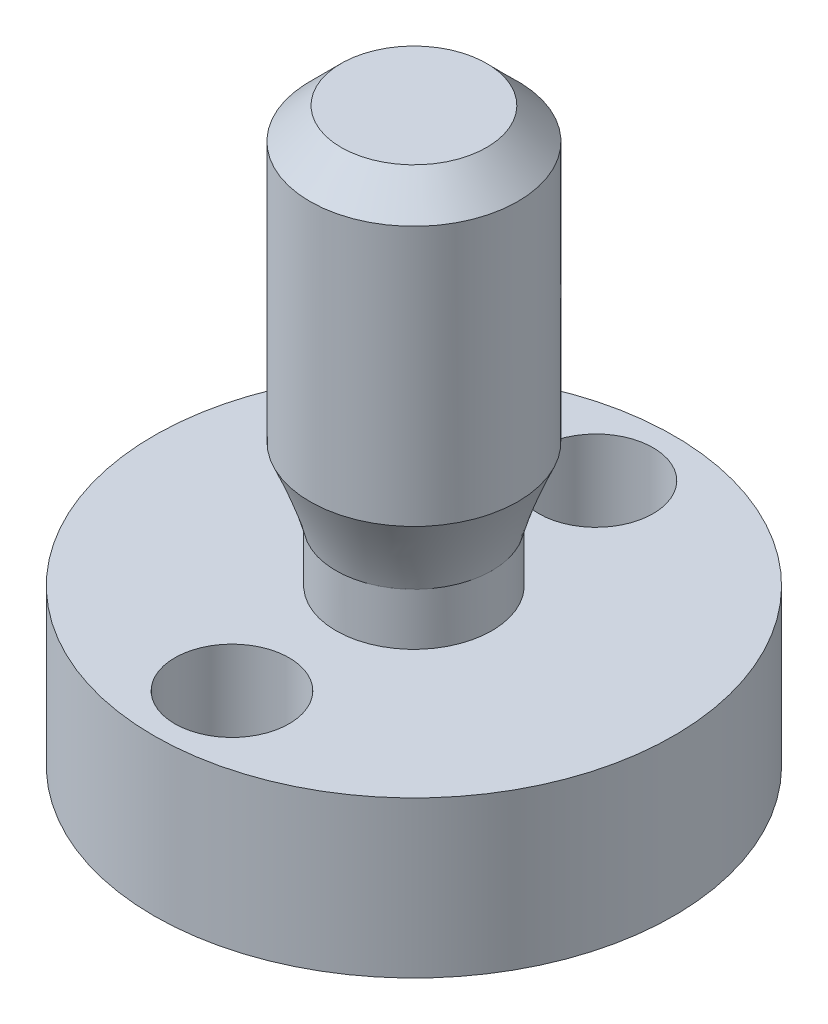
ISO-10303-21;
HEADER;
FILE_DESCRIPTION(('STEP AP214'),'2;1');
FILE_NAME('part.step','',(''),(''),'','','');
FILE_SCHEMA(('AUTOMOTIVE_DESIGN { 1 0 10303 214 1 1 1 1 }'));
ENDSEC;
DATA;
#1=APPLICATION_CONTEXT('core data for automotive mechanical design processes');
#2=APPLICATION_PROTOCOL_DEFINITION('international standard','automotive_design',2000,#1);
#3=PRODUCT_CONTEXT('',#1,'mechanical');
#4=PRODUCT('Part','Part','',(#3));
#5=PRODUCT_RELATED_PRODUCT_CATEGORY('part','',(#4));
#6=PRODUCT_DEFINITION_FORMATION('','',#4);
#7=PRODUCT_DEFINITION_CONTEXT('part definition',#1,'design');
#8=PRODUCT_DEFINITION('design','',#6,#7);
#9=PRODUCT_DEFINITION_SHAPE('','',#8);
#10=(LENGTH_UNIT() NAMED_UNIT(*) SI_UNIT(.MILLI.,.METRE.));
#11=(NAMED_UNIT(*) PLANE_ANGLE_UNIT() SI_UNIT($,.RADIAN.));
#12=(NAMED_UNIT(*) SI_UNIT($,.STERADIAN.) SOLID_ANGLE_UNIT());
#13=UNCERTAINTY_MEASURE_WITH_UNIT(LENGTH_MEASURE(1.E-05),#10,'distance_accuracy_value','');
#14=(GEOMETRIC_REPRESENTATION_CONTEXT(3) GLOBAL_UNCERTAINTY_ASSIGNED_CONTEXT((#13)) GLOBAL_UNIT_ASSIGNED_CONTEXT((#10,
#11,#12)) REPRESENTATION_CONTEXT('',''));
#15=CARTESIAN_POINT('',(0.,0.,0.));
#16=DIRECTION('',(0.,0.,1.));
#17=DIRECTION('',(1.,0.,0.));
#18=AXIS2_PLACEMENT_3D('',#15,#16,#17);
#19=CARTESIAN_POINT('',(0.,0.,0.));
#20=DIRECTION('',(0.,1.,0.));
#21=DIRECTION('',(0.,0.,1.));
#22=AXIS2_PLACEMENT_3D('',#19,#20,#21);
#23=PLANE('',#22);
#24=CARTESIAN_POINT('',(0.,0.,0.));
#25=DIRECTION('',(0.,-1.,0.));
#26=DIRECTION('',(0.,0.,-1.));
#27=AXIS2_PLACEMENT_3D('',#24,#25,#26);
#28=CIRCLE('',#27,7.5);
#29=CARTESIAN_POINT('',(0.,0.,-7.5));
#30=VERTEX_POINT('',#29);
#31=EDGE_CURVE('E13',#30,#30,#28,.T.);
#32=ORIENTED_EDGE('',*,*,#31,.F.);
#33=EDGE_LOOP('',(#32));
#34=FACE_BOUND('',#33,.T.);
#35=ADVANCED_FACE('F49',(#34),#23,.T.);
#36=CARTESIAN_POINT('',(0.,0.,0.));
#37=DIRECTION('',(0.,-1.,0.));
#38=DIRECTION('',(0.,0.,-1.));
#39=AXIS2_PLACEMENT_3D('',#36,#37,#38);
#40=CYLINDRICAL_SURFACE('',#39,7.5);
#41=ORIENTED_EDGE('',*,*,#31,.T.);
#42=EDGE_LOOP('',(#41));
#43=FACE_BOUND('',#42,.T.);
#44=CARTESIAN_POINT('',(0.,-2.,0.));
#45=DIRECTION('',(0.,-1.,0.));
#46=DIRECTION('',(0.,0.,-1.));
#47=AXIS2_PLACEMENT_3D('',#44,#45,#46);
#48=CIRCLE('',#47,7.5);
#49=CARTESIAN_POINT('',(0.,-2.,-7.5));
#50=VERTEX_POINT('',#49);
#51=EDGE_CURVE('E52',#50,#50,#48,.T.);
#52=ORIENTED_EDGE('',*,*,#51,.F.);
#53=EDGE_LOOP('',(#52));
#54=FACE_BOUND('',#53,.T.);
#55=ADVANCED_FACE('F63',(#43,#54),#40,.T.);
#56=CARTESIAN_POINT('',(0.,-2.,0.));
#57=DIRECTION('',(0.,1.,0.));
#58=DIRECTION('',(0.,0.,1.));
#59=AXIS2_PLACEMENT_3D('',#56,#57,#58);
#60=PLANE('',#59);
#61=ORIENTED_EDGE('',*,*,#51,.T.);
#62=EDGE_LOOP('',(#61));
#63=FACE_BOUND('',#62,.T.);
#64=ADVANCED_FACE('F61',(#63),#60,.F.);
#65=CLOSED_SHELL('',(#35,#55,#64));
#66=MANIFOLD_SOLID_BREP('B2',#65);
#67=CARTESIAN_POINT('',(0.,15.,-17.5));
#68=DIRECTION('',(0.,-1.,0.));
#69=DIRECTION('',(0.,0.,-1.));
#70=AXIS2_PLACEMENT_3D('',#67,#68,#69);
#71=CYLINDRICAL_SURFACE('',#70,5.5);
#72=CARTESIAN_POINT('',(0.,5.,-17.5));
#73=DIRECTION('',(0.,1.,0.));
#74=DIRECTION('',(0.,0.,1.));
#75=AXIS2_PLACEMENT_3D('',#72,#73,#74);
#76=CIRCLE('',#75,5.5);
#77=CARTESIAN_POINT('',(0.,5.,-12.));
#78=VERTEX_POINT('',#77);
#79=EDGE_CURVE('E105',#78,#78,#76,.T.);
#80=ORIENTED_EDGE('',*,*,#79,.F.);
#81=EDGE_LOOP('',(#80));
#82=FACE_BOUND('',#81,.T.);
#83=CARTESIAN_POINT('',(0.,15.,-17.5));
#84=DIRECTION('',(0.,1.,0.));
#85=DIRECTION('',(0.,0.,1.));
#86=AXIS2_PLACEMENT_3D('',#83,#84,#85);
#87=CIRCLE('',#86,5.5);
#88=CARTESIAN_POINT('',(0.,15.,-12.));
#89=VERTEX_POINT('',#88);
#90=EDGE_CURVE('E143',#89,#89,#87,.T.);
#91=ORIENTED_EDGE('',*,*,#90,.T.);
#92=EDGE_LOOP('',(#91));
#93=FACE_BOUND('',#92,.T.);
#94=ADVANCED_FACE('F89',(#82,#93),#71,.F.);
#95=CARTESIAN_POINT('',(0.,15.,17.5));
#96=DIRECTION('',(0.,-1.,0.));
#97=DIRECTION('',(0.,0.,-1.));
#98=AXIS2_PLACEMENT_3D('',#95,#96,#97);
#99=CYLINDRICAL_SURFACE('',#98,5.5);
#100=CARTESIAN_POINT('',(0.,5.,17.5));
#101=DIRECTION('',(0.,1.,0.));
#102=DIRECTION('',(0.,0.,1.));
#103=AXIS2_PLACEMENT_3D('',#100,#101,#102);
#104=CIRCLE('',#103,5.5);
#105=CARTESIAN_POINT('',(0.,5.,23.));
#106=VERTEX_POINT('',#105);
#107=EDGE_CURVE('E101',#106,#106,#104,.T.);
#108=ORIENTED_EDGE('',*,*,#107,.F.);
#109=EDGE_LOOP('',(#108));
#110=FACE_BOUND('',#109,.T.);
#111=CARTESIAN_POINT('',(0.,15.,17.5));
#112=DIRECTION('',(0.,1.,0.));
#113=DIRECTION('',(0.,0.,1.));
#114=AXIS2_PLACEMENT_3D('',#111,#112,#113);
#115=CIRCLE('',#114,5.5);
#116=CARTESIAN_POINT('',(0.,15.,23.));
#117=VERTEX_POINT('',#116);
#118=EDGE_CURVE('E140',#117,#117,#115,.T.);
#119=ORIENTED_EDGE('',*,*,#118,.T.);
#120=EDGE_LOOP('',(#119));
#121=FACE_BOUND('',#120,.T.);
#122=ADVANCED_FACE('F185',(#110,#121),#99,.F.);
#123=CARTESIAN_POINT('',(0.,15.,0.));
#124=DIRECTION('',(0.,-1.,0.));
#125=DIRECTION('',(0.,0.,-1.));
#126=AXIS2_PLACEMENT_3D('',#123,#124,#125);
#127=CYLINDRICAL_SURFACE('',#126,25.);
#128=CARTESIAN_POINT('',(0.,15.,0.));
#129=DIRECTION('',(0.,1.,0.));
#130=DIRECTION('',(0.,0.,1.));
#131=AXIS2_PLACEMENT_3D('',#128,#129,#130);
#132=CIRCLE('',#131,25.);
#133=CARTESIAN_POINT('',(0.,15.,25.));
#134=VERTEX_POINT('',#133);
#135=EDGE_CURVE('E146',#134,#134,#132,.T.);
#136=ORIENTED_EDGE('',*,*,#135,.F.);
#137=EDGE_LOOP('',(#136));
#138=FACE_BOUND('',#137,.T.);
#139=CARTESIAN_POINT('',(0.,0.,0.));
#140=DIRECTION('',(0.,1.,0.));
#141=DIRECTION('',(0.,0.,1.));
#142=AXIS2_PLACEMENT_3D('',#139,#140,#141);
#143=CIRCLE('',#142,25.);
#144=CARTESIAN_POINT('',(0.,0.,25.));
#145=VERTEX_POINT('',#144);
#146=EDGE_CURVE('E139',#145,#145,#143,.T.);
#147=ORIENTED_EDGE('',*,*,#146,.T.);
#148=EDGE_LOOP('',(#147));
#149=FACE_BOUND('',#148,.T.);
#150=ADVANCED_FACE('F191',(#138,#149),#127,.T.);
#151=CARTESIAN_POINT('',(0.,15.,0.));
#152=DIRECTION('',(0.,1.,0.));
#153=DIRECTION('',(0.,0.,1.));
#154=AXIS2_PLACEMENT_3D('',#151,#152,#153);
#155=PLANE('',#154);
#156=CARTESIAN_POINT('',(0.,15.,0.));
#157=DIRECTION('',(0.,1.,0.));
#158=DIRECTION('',(0.,0.,1.));
#159=AXIS2_PLACEMENT_3D('',#156,#157,#158);
#160=CIRCLE('',#159,7.5);
#161=CARTESIAN_POINT('',(0.,15.,7.5));
#162=VERTEX_POINT('',#161);
#163=EDGE_CURVE('E136',#162,#162,#160,.F.);
#164=ORIENTED_EDGE('',*,*,#163,.T.);
#165=EDGE_LOOP('',(#164));
#166=FACE_BOUND('',#165,.T.);
#167=ORIENTED_EDGE('',*,*,#118,.F.);
#168=EDGE_LOOP('',(#167));
#169=FACE_BOUND('',#168,.T.);
#170=ORIENTED_EDGE('',*,*,#90,.F.);
#171=EDGE_LOOP('',(#170));
#172=FACE_BOUND('',#171,.T.);
#173=ORIENTED_EDGE('',*,*,#135,.T.);
#174=EDGE_LOOP('',(#173));
#175=FACE_BOUND('',#174,.T.);
#176=ADVANCED_FACE('F179',(#166,#169,#172,#175),#155,.T.);
#177=CARTESIAN_POINT('',(0.,0.,0.));
#178=DIRECTION('',(0.,1.,0.));
#179=DIRECTION('',(0.,0.,1.));
#180=AXIS2_PLACEMENT_3D('',#177,#178,#179);
#181=PLANE('',#180);
#182=ORIENTED_EDGE('',*,*,#146,.F.);
#183=EDGE_LOOP('',(#182));
#184=FACE_BOUND('',#183,.T.);
#185=CARTESIAN_POINT('',(0.,0.,-17.5));
#186=DIRECTION('',(0.,1.,0.));
#187=DIRECTION('',(0.,0.,1.));
#188=AXIS2_PLACEMENT_3D('',#185,#186,#187);
#189=CIRCLE('',#188,3.3);
#190=CARTESIAN_POINT('',(0.,0.,-14.2));
#191=VERTEX_POINT('',#190);
#192=EDGE_CURVE('E127',#191,#191,#189,.T.);
#193=ORIENTED_EDGE('',*,*,#192,.T.);
#194=EDGE_LOOP('',(#193));
#195=FACE_BOUND('',#194,.T.);
#196=CARTESIAN_POINT('',(0.,0.,17.5));
#197=DIRECTION('',(0.,1.,0.));
#198=DIRECTION('',(0.,0.,1.));
#199=AXIS2_PLACEMENT_3D('',#196,#197,#198);
#200=CIRCLE('',#199,3.3);
#201=CARTESIAN_POINT('',(0.,0.,20.8));
#202=VERTEX_POINT('',#201);
#203=EDGE_CURVE('E112',#202,#202,#200,.T.);
#204=ORIENTED_EDGE('',*,*,#203,.T.);
#205=EDGE_LOOP('',(#204));
#206=FACE_BOUND('',#205,.T.);
#207=ADVANCED_FACE('F169',(#184,#195,#206),#181,.F.);
#208=CARTESIAN_POINT('',(0.,20.,0.));
#209=DIRECTION('',(0.,-1.,0.));
#210=DIRECTION('',(0.,0.,-1.));
#211=AXIS2_PLACEMENT_3D('',#208,#209,#210);
#212=CYLINDRICAL_SURFACE('',#211,7.5);
#213=ORIENTED_EDGE('',*,*,#163,.F.);
#214=EDGE_LOOP('',(#213));
#215=FACE_BOUND('',#214,.T.);
#216=CARTESIAN_POINT('',(0.,20.,0.));
#217=DIRECTION('',(0.,-1.,0.));
#218=DIRECTION('',(0.,0.,-1.));
#219=AXIS2_PLACEMENT_3D('',#216,#217,#218);
#220=CIRCLE('',#219,7.5);
#221=CARTESIAN_POINT('',(-4.51068498275979,20.,-5.99197137729356));
#222=VERTEX_POINT('',#221);
#223=EDGE_CURVE('E133',#222,#222,#220,.F.);
#224=ORIENTED_EDGE('',*,*,#223,.F.);
#225=EDGE_LOOP('',(#224));
#226=FACE_BOUND('',#225,.T.);
#227=ADVANCED_FACE('F166',(#215,#226),#212,.T.);
#228=CARTESIAN_POINT('',(0.,5.,-17.5));
#229=DIRECTION('',(0.,-1.,0.));
#230=DIRECTION('',(0.,0.,-1.));
#231=AXIS2_PLACEMENT_3D('',#228,#229,#230);
#232=CYLINDRICAL_SURFACE('',#231,3.3);
#233=CARTESIAN_POINT('',(0.,5.,-17.5));
#234=DIRECTION('',(0.,1.,0.));
#235=DIRECTION('',(0.,0.,1.));
#236=AXIS2_PLACEMENT_3D('',#233,#234,#235);
#237=CIRCLE('',#236,3.3);
#238=CARTESIAN_POINT('',(0.,5.,-14.2));
#239=VERTEX_POINT('',#238);
#240=EDGE_CURVE('E130',#239,#239,#237,.T.);
#241=ORIENTED_EDGE('',*,*,#240,.T.);
#242=EDGE_LOOP('',(#241));
#243=FACE_BOUND('',#242,.T.);
#244=ORIENTED_EDGE('',*,*,#192,.F.);
#245=EDGE_LOOP('',(#244));
#246=FACE_BOUND('',#245,.T.);
#247=ADVANCED_FACE('F168',(#243,#246),#232,.F.);
#248=CARTESIAN_POINT('',(0.,5.,0.));
#249=DIRECTION('',(0.,1.,0.));
#250=DIRECTION('',(0.,0.,1.));
#251=AXIS2_PLACEMENT_3D('',#248,#249,#250);
#252=PLANE('',#251);
#253=ORIENTED_EDGE('',*,*,#240,.F.);
#254=EDGE_LOOP('',(#253));
#255=FACE_BOUND('',#254,.T.);
#256=ORIENTED_EDGE('',*,*,#79,.T.);
#257=EDGE_LOOP('',(#256));
#258=FACE_BOUND('',#257,.T.);
#259=ADVANCED_FACE('F176',(#255,#258),#252,.T.);
#260=CARTESIAN_POINT('',(0.,5.,17.5));
#261=DIRECTION('',(0.,-1.,0.));
#262=DIRECTION('',(0.,0.,-1.));
#263=AXIS2_PLACEMENT_3D('',#260,#261,#262);
#264=CYLINDRICAL_SURFACE('',#263,3.3);
#265=CARTESIAN_POINT('',(0.,5.,17.5));
#266=DIRECTION('',(0.,1.,0.));
#267=DIRECTION('',(0.,0.,1.));
#268=AXIS2_PLACEMENT_3D('',#265,#266,#267);
#269=CIRCLE('',#268,3.3);
#270=CARTESIAN_POINT('',(0.,5.,20.8));
#271=VERTEX_POINT('',#270);
#272=EDGE_CURVE('E124',#271,#271,#269,.T.);
#273=ORIENTED_EDGE('',*,*,#272,.T.);
#274=EDGE_LOOP('',(#273));
#275=FACE_BOUND('',#274,.T.);
#276=ORIENTED_EDGE('',*,*,#203,.F.);
#277=EDGE_LOOP('',(#276));
#278=FACE_BOUND('',#277,.T.);
#279=ADVANCED_FACE('F215',(#275,#278),#264,.F.);
#280=CARTESIAN_POINT('',(0.,5.,0.));
#281=DIRECTION('',(0.,1.,0.));
#282=DIRECTION('',(0.,0.,1.));
#283=AXIS2_PLACEMENT_3D('',#280,#281,#282);
#284=PLANE('',#283);
#285=ORIENTED_EDGE('',*,*,#272,.F.);
#286=EDGE_LOOP('',(#285));
#287=FACE_BOUND('',#286,.T.);
#288=ORIENTED_EDGE('',*,*,#107,.T.);
#289=EDGE_LOOP('',(#288));
#290=FACE_BOUND('',#289,.T.);
#291=ADVANCED_FACE('F163',(#287,#290),#284,.T.);
#292=CARTESIAN_POINT('',(-8.60422016966909,27.,-5.09582135399776));
#293=CARTESIAN_POINT('',(-4.51068498275979,20.,-5.99197137729356));
#294=CARTESIAN_POINT('',(1.58742253832643,27.,-22.3042616933359));
#295=CARTESIAN_POINT('',(7.47325777182733,20.,-15.0133413428131));
#296=CARTESIAN_POINT('',(18.7958628776646,27.,-12.1126189853404));
#297=CARTESIAN_POINT('',(16.4946277373469,20.,-3.02939858822602));
#298=CARTESIAN_POINT('',(8.60422016966909,27.,5.09582135399776));
#299=CARTESIAN_POINT('',(4.51068498275979,20.,5.99197137729356));
#300=CARTESIAN_POINT('',(-1.58742253832643,27.,22.3042616933359));
#301=CARTESIAN_POINT('',(-7.47325777182733,20.,15.0133413428131));
#302=CARTESIAN_POINT('',(-18.7958628776646,27.,12.1126189853404));
#303=CARTESIAN_POINT('',(-16.4946277373469,20.,3.02939858822602));
#304=CARTESIAN_POINT('',(-8.60422016966909,27.,-5.09582135399776));
#305=CARTESIAN_POINT('',(-4.51068498275979,20.,-5.99197137729356));
#306=(BOUNDED_SURFACE() B_SPLINE_SURFACE(3,1,((#292,#293),(#294,#295),(#296,#297),(#298,#299),
(#300,#301),(#302,#303),(#304,#305)),.UNSPECIFIED.,.T.,.F.,.F.) B_SPLINE_SURFACE_WITH_KNOTS((4,
3,4),(2,2),(0.,0.5,1.),(0.,1.),
.UNSPECIFIED.) GEOMETRIC_REPRESENTATION_ITEM() RATIONAL_B_SPLINE_SURFACE(((1.,1.),
(0.333333333333333,0.333333333333333),(0.333333333333333,0.333333333333333),(1.,1.),
(0.333333333333333,0.333333333333334),(0.333333333333333,0.333333333333334),(1.,1.))) REPRESENTATION_ITEM('') SURFACE());
#307=CARTESIAN_POINT('',(0.,27.,0.));
#308=DIRECTION('',(0.,1.,0.));
#309=DIRECTION('',(0.,0.,1.));
#310=AXIS2_PLACEMENT_3D('',#307,#308,#309);
#311=CIRCLE('',#310,10.);
#312=CARTESIAN_POINT('',(-8.60422016966909,27.,-5.09582135399776));
#313=VERTEX_POINT('',#312);
#314=EDGE_CURVE('E108',#313,#313,#311,.T.);
#315=CARTESIAN_POINT('',(-8.60422016966909,27.,-5.09582135399776));
#316=CARTESIAN_POINT('',(-8.56157917813879,26.9270833333333,-5.10515625007376));
#317=CARTESIAN_POINT('',(-8.51893818660848,26.8541666666667,-5.11449114614976));
#318=CARTESIAN_POINT('',(-8.43365620354787,26.7083333333333,-5.13316093830176));
#319=CARTESIAN_POINT('',(-8.39101521201757,26.6354166666667,-5.14249583437775));
#320=CARTESIAN_POINT('',(-8.30573322895695,26.4895833333333,-5.16116562652975));
#321=CARTESIAN_POINT('',(-8.26309223742665,26.4166666666667,-5.17050052260575));
#322=CARTESIAN_POINT('',(-8.17781025436604,26.2708333333333,-5.18917031475774));
#323=CARTESIAN_POINT('',(-8.13516926283573,26.1979166666667,-5.19850521083374));
#324=CARTESIAN_POINT('',(-8.04988727977512,26.0520833333333,-5.21717500298574));
#325=CARTESIAN_POINT('',(-8.00724628824482,25.9791666666667,-5.22650989906173));
#326=CARTESIAN_POINT('',(-7.92196430518421,25.8333333333333,-5.24517969121373));
#327=CARTESIAN_POINT('',(-7.8793233136539,25.7604166666667,-5.25451458728973));
#328=CARTESIAN_POINT('',(-7.79404133059329,25.6145833333333,-5.27318437944172));
#329=CARTESIAN_POINT('',(-7.75140033906299,25.5416666666667,-5.28251927551772));
#330=CARTESIAN_POINT('',(-7.66611835600238,25.3958333333333,-5.30118906766972));
#331=CARTESIAN_POINT('',(-7.62347736447207,25.3229166666667,-5.31052396374572));
#332=CARTESIAN_POINT('',(-7.53819538141146,25.1770833333333,-5.32919375589771));
#333=CARTESIAN_POINT('',(-7.49555438988116,25.1041666666667,-5.33852865197371));
#334=CARTESIAN_POINT('',(-7.41027240682055,24.9583333333333,-5.35719844412571));
#335=CARTESIAN_POINT('',(-7.36763141529024,24.8854166666667,-5.3665333402017));
#336=CARTESIAN_POINT('',(-7.28234943222963,24.7395833333333,-5.3852031323537));
#337=CARTESIAN_POINT('',(-7.23970844069933,24.6666666666667,-5.3945380284297));
#338=CARTESIAN_POINT('',(-7.15442645763871,24.5208333333333,-5.41320782058169));
#339=CARTESIAN_POINT('',(-7.11178546610841,24.4479166666667,-5.42254271665769));
#340=CARTESIAN_POINT('',(-7.0265034830478,24.3020833333333,-5.44121250880969));
#341=CARTESIAN_POINT('',(-6.98386249151749,24.2291666666667,-5.45054740488568));
#342=CARTESIAN_POINT('',(-6.89858050845688,24.0833333333333,-5.46921719703768));
#343=CARTESIAN_POINT('',(-6.85593951692658,24.0104166666667,-5.47855209311368));
#344=CARTESIAN_POINT('',(-6.77065753386597,23.8645833333333,-5.49722188526567));
#345=CARTESIAN_POINT('',(-6.72801654233566,23.7916666666667,-5.50655678134167));
#346=CARTESIAN_POINT('',(-6.64273455927505,23.6458333333333,-5.52522657349367));
#347=CARTESIAN_POINT('',(-6.60009356774475,23.5729166666667,-5.53456146956966));
#348=CARTESIAN_POINT('',(-6.51481158468414,23.4270833333333,-5.55323126172166));
#349=CARTESIAN_POINT('',(-6.47217059315383,23.3541666666667,-5.56256615779766));
#350=CARTESIAN_POINT('',(-6.38688861009322,23.2083333333333,-5.58123594994965));
#351=CARTESIAN_POINT('',(-6.34424761856291,23.1354166666667,-5.59057084602565));
#352=CARTESIAN_POINT('',(-6.2589656355023,22.9895833333333,-5.60924063817765));
#353=CARTESIAN_POINT('',(-6.216324643972,22.9166666666667,-5.61857553425365));
#354=CARTESIAN_POINT('',(-6.13104266091139,22.7708333333333,-5.63724532640564));
#355=CARTESIAN_POINT('',(-6.08840166938108,22.6979166666667,-5.64658022248164));
#356=CARTESIAN_POINT('',(-6.00311968632047,22.5520833333333,-5.66525001463364));
#357=CARTESIAN_POINT('',(-5.96047869479017,22.4791666666667,-5.67458491070963));
#358=CARTESIAN_POINT('',(-5.87519671172956,22.3333333333333,-5.69325470286163));
#359=CARTESIAN_POINT('',(-5.83255572019925,22.2604166666667,-5.70258959893763));
#360=CARTESIAN_POINT('',(-5.74727373713864,22.1145833333333,-5.72125939108962));
#361=CARTESIAN_POINT('',(-5.70463274560834,22.0416666666667,-5.73059428716562));
#362=CARTESIAN_POINT('',(-5.61935076254773,21.8958333333333,-5.74926407931762));
#363=CARTESIAN_POINT('',(-5.57670977101742,21.8229166666667,-5.75859897539361));
#364=CARTESIAN_POINT('',(-5.49142778795681,21.6770833333333,-5.77726876754561));
#365=CARTESIAN_POINT('',(-5.4487867964265,21.6041666666667,-5.78660366362161));
#366=CARTESIAN_POINT('',(-5.36350481336589,21.4583333333333,-5.8052734557736));
#367=CARTESIAN_POINT('',(-5.32086382183559,21.3854166666667,-5.8146083518496));
#368=CARTESIAN_POINT('',(-5.23558183877498,21.2395833333333,-5.8332781440016));
#369=CARTESIAN_POINT('',(-5.19294084724467,21.1666666666667,-5.8426130400776));
#370=CARTESIAN_POINT('',(-5.10765886418406,21.0208333333333,-5.86128283222959));
#371=CARTESIAN_POINT('',(-5.06501787265376,20.9479166666667,-5.87061772830559));
#372=CARTESIAN_POINT('',(-4.97973588959315,20.8020833333333,-5.88928752045758));
#373=CARTESIAN_POINT('',(-4.93709489806284,20.7291666666667,-5.89862241653358));
#374=CARTESIAN_POINT('',(-4.85181291500223,20.5833333333333,-5.91729220868558));
#375=CARTESIAN_POINT('',(-4.80917192347193,20.5104166666667,-5.92662710476158));
#376=CARTESIAN_POINT('',(-4.72388994041131,20.3645833333333,-5.94529689691357));
#377=CARTESIAN_POINT('',(-4.68124894888101,20.2916666666667,-5.95463179298957));
#378=CARTESIAN_POINT('',(-4.5959669658204,20.1458333333333,-5.97330158514157));
#379=CARTESIAN_POINT('',(-4.55332597429009,20.0729166666667,-5.98263648121756));
#380=CARTESIAN_POINT('',(-4.51068498275979,20.,-5.99197137729356));
#381=B_SPLINE_CURVE_WITH_KNOTS('',3,(#315,#316,#317,#318,#319,#320,#321,#322,#323,#324,#325,
#326,#327,#328,#329,#330,#331,#332,#333,#334,#335,#336,#337,#338,#339,#340,#341,#342,#343,#344,
#345,#346,#347,#348,#349,#350,#351,#352,#353,#354,#355,#356,#357,#358,#359,#360,#361,#362,#363,
#364,#365,#366,#367,#368,#369,#370,#371,#372,#373,#374,#375,#376,#377,#378,#379,#380),
.UNSPECIFIED.,.F.,.F.,(4,2,2,2,2,2,2,2,2,2,2,2,2,2,2,2,2,2,2,2,2,2,2,2,2,2,2,2,2,2,2,2,4),(0.,
0.254951196292418,0.509902392584837,0.764853588877255,1.01980478516967,1.27475598146209,
1.52970717775451,1.78465837404693,2.03960957033934,2.29456076663177,2.54951196292418,
2.8044631592166,3.05941435550902,3.31436555180144,3.56931674809385,3.82426794438627,
4.07921914067869,4.33417033697111,4.58912153326353,4.84407272955595,5.09902392584837,
5.35397512214078,5.6089263184332,5.86387751472562,6.11882871101804,6.37377990731046,
6.62873110360287,6.88368229989529,7.13863349618771,7.39358469248013,7.64853588877255,
7.90348708506497,8.15843828135738),.UNSPECIFIED.);
#382=EDGE_CURVE('BSEAM160',#313,#222,#381,.T.);
#383=ORIENTED_EDGE('',*,*,#314,.F.);
#384=ORIENTED_EDGE('',*,*,#223,.T.);
#385=ORIENTED_EDGE('',*,*,#382,.T.);
#386=ORIENTED_EDGE('',*,*,#382,.F.);
#387=EDGE_LOOP('',(#383,#385,#384,#386));
#388=FACE_BOUND('',#387,.T.);
#389=ADVANCED_FACE('F160',(#388),#306,.T.);
#390=CARTESIAN_POINT('',(0.,55.,0.));
#391=DIRECTION('',(0.,-1.,0.));
#392=DIRECTION('',(0.,0.,-1.));
#393=AXIS2_PLACEMENT_3D('',#390,#391,#392);
#394=CYLINDRICAL_SURFACE('',#393,10.);
#395=CARTESIAN_POINT('',(0.,52.,0.));
#396=DIRECTION('',(0.,1.,0.));
#397=DIRECTION('',(0.,0.,1.));
#398=AXIS2_PLACEMENT_3D('',#395,#396,#397);
#399=CIRCLE('',#398,10.);
#400=CARTESIAN_POINT('',(0.,52.,10.));
#401=VERTEX_POINT('',#400);
#402=EDGE_CURVE('E48',#401,#401,#399,.F.);
#403=ORIENTED_EDGE('',*,*,#402,.T.);
#404=EDGE_LOOP('',(#403));
#405=FACE_BOUND('',#404,.T.);
#406=ORIENTED_EDGE('',*,*,#314,.T.);
#407=EDGE_LOOP('',(#406));
#408=FACE_BOUND('',#407,.T.);
#409=ADVANCED_FACE('F158',(#405,#408),#394,.T.);
#410=CARTESIAN_POINT('',(0.,55.,0.));
#411=DIRECTION('',(0.,1.,0.));
#412=DIRECTION('',(0.,0.,1.));
#413=AXIS2_PLACEMENT_3D('',#410,#411,#412);
#414=PLANE('',#413);
#415=CARTESIAN_POINT('',(0.,55.,0.));
#416=DIRECTION('',(0.,1.,0.));
#417=DIRECTION('',(0.,0.,1.));
#418=AXIS2_PLACEMENT_3D('',#415,#416,#417);
#419=CIRCLE('',#418,7.00000000000002);
#420=CARTESIAN_POINT('',(0.,55.,7.00000000000002));
#421=VERTEX_POINT('',#420);
#422=EDGE_CURVE('E97',#421,#421,#419,.T.);
#423=ORIENTED_EDGE('',*,*,#422,.T.);
#424=EDGE_LOOP('',(#423));
#425=FACE_BOUND('',#424,.T.);
#426=ADVANCED_FACE('F238',(#425),#414,.T.);
#427=CARTESIAN_POINT('',(0.,55.,0.));
#428=DIRECTION('',(0.,-1.,0.));
#429=DIRECTION('',(0.,0.,-1.));
#430=AXIS2_PLACEMENT_3D('',#427,#428,#429);
#431=CONICAL_SURFACE('',#430,7.00000000000002,0.785398163397445);
#432=ORIENTED_EDGE('',*,*,#402,.F.);
#433=EDGE_LOOP('',(#432));
#434=FACE_BOUND('',#433,.T.);
#435=ORIENTED_EDGE('',*,*,#422,.F.);
#436=EDGE_LOOP('',(#435));
#437=FACE_BOUND('',#436,.T.);
#438=ADVANCED_FACE('F92',(#434,#437),#431,.T.);
#439=CLOSED_SHELL('',(#94,#122,#150,#176,#207,#227,#247,#259,#279,#291,#389,#409,#426,#438));
#440=MANIFOLD_SOLID_BREP('B8',#439);
#441=ADVANCED_BREP_SHAPE_REPRESENTATION('',(#18,#66,#440),#14);
#442=SHAPE_DEFINITION_REPRESENTATION(#9,#441);
ENDSEC;
END-ISO-10303-21;
